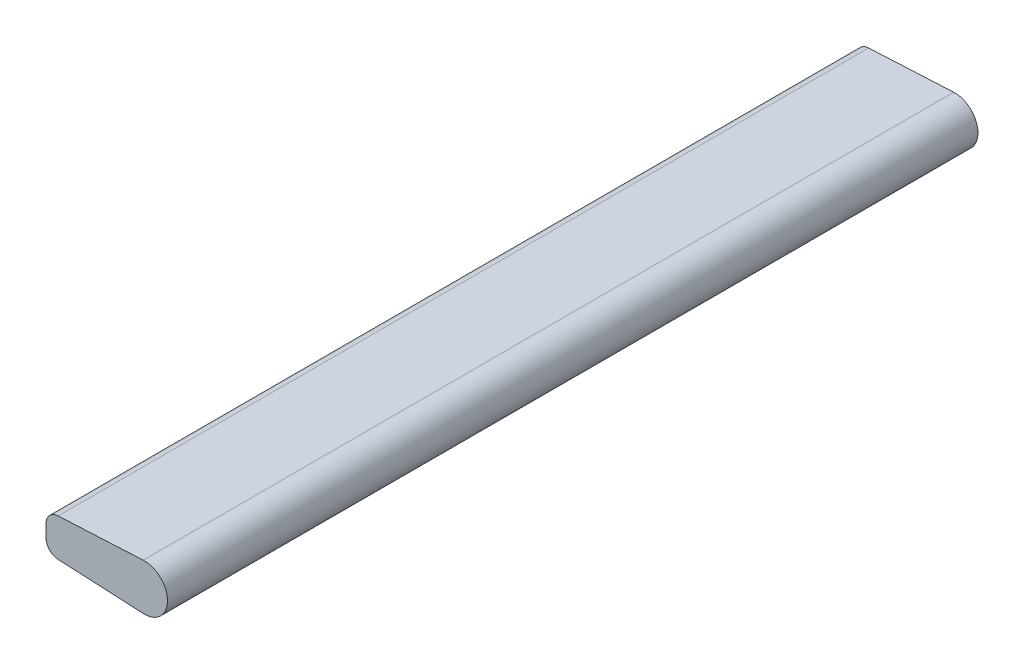
ISO-10303-21;
HEADER;
FILE_DESCRIPTION(('STEP AP214'),'2;1');
FILE_NAME('part.step','',(''),(''),'','','');
FILE_SCHEMA(('AUTOMOTIVE_DESIGN { 1 0 10303 214 1 1 1 1 }'));
ENDSEC;
DATA;
#1=APPLICATION_CONTEXT('core data for automotive mechanical design processes');
#2=APPLICATION_PROTOCOL_DEFINITION('international standard','automotive_design',2000,#1);
#3=PRODUCT_CONTEXT('',#1,'mechanical');
#4=PRODUCT('Part','Part','',(#3));
#5=PRODUCT_RELATED_PRODUCT_CATEGORY('part','',(#4));
#6=PRODUCT_DEFINITION_FORMATION('','',#4);
#7=PRODUCT_DEFINITION_CONTEXT('part definition',#1,'design');
#8=PRODUCT_DEFINITION('design','',#6,#7);
#9=PRODUCT_DEFINITION_SHAPE('','',#8);
#10=(LENGTH_UNIT() NAMED_UNIT(*) SI_UNIT(.MILLI.,.METRE.));
#11=(NAMED_UNIT(*) PLANE_ANGLE_UNIT() SI_UNIT($,.RADIAN.));
#12=(NAMED_UNIT(*) SI_UNIT($,.STERADIAN.) SOLID_ANGLE_UNIT());
#13=UNCERTAINTY_MEASURE_WITH_UNIT(LENGTH_MEASURE(1.E-05),#10,'distance_accuracy_value','');
#14=(GEOMETRIC_REPRESENTATION_CONTEXT(3) GLOBAL_UNCERTAINTY_ASSIGNED_CONTEXT((#13)) GLOBAL_UNIT_ASSIGNED_CONTEXT((#10,
#11,#12)) REPRESENTATION_CONTEXT('',''));
#15=CARTESIAN_POINT('',(0.,0.,0.));
#16=DIRECTION('',(0.,0.,1.));
#17=DIRECTION('',(1.,0.,0.));
#18=AXIS2_PLACEMENT_3D('',#15,#16,#17);
#19=CARTESIAN_POINT('',(-10.3425,1.5,100.));
#20=DIRECTION('',(0.,0.,-1.));
#21=DIRECTION('',(-1.,0.,0.));
#22=AXIS2_PLACEMENT_3D('',#19,#20,#21);
#23=CYLINDRICAL_SURFACE('',#22,3.15393504213387);
#24=CARTESIAN_POINT('',(-10.3425,1.5,-100.));
#25=DIRECTION('',(0.,0.,1.));
#26=DIRECTION('',(-1.,0.,0.));
#27=AXIS2_PLACEMENT_3D('',#24,#25,#26);
#28=CIRCLE('',#27,3.15393504213387);
#29=CARTESIAN_POINT('',(-10.5,4.65,-100.));
#30=VERTEX_POINT('',#29);
#31=CARTESIAN_POINT('',(-13.4964350421339,1.5,-100.));
#32=VERTEX_POINT('',#31);
#33=EDGE_CURVE('E118',#30,#32,#28,.T.);
#34=ORIENTED_EDGE('',*,*,#33,.T.);
#35=DIRECTION('',(0.,0.,-1.));
#36=VECTOR('',#35,1.);
#37=CARTESIAN_POINT('',(-13.4964350421339,1.5,100.));
#38=LINE('',#37,#36);
#39=CARTESIAN_POINT('',(-13.4964350421339,1.5,100.));
#40=VERTEX_POINT('',#39);
#41=EDGE_CURVE('E11',#40,#32,#38,.T.);
#42=ORIENTED_EDGE('',*,*,#41,.F.);
#43=CARTESIAN_POINT('',(-10.3425,1.5,100.));
#44=DIRECTION('',(0.,0.,1.));
#45=DIRECTION('',(-1.,0.,0.));
#46=AXIS2_PLACEMENT_3D('',#43,#44,#45);
#47=CIRCLE('',#46,3.15393504213387);
#48=CARTESIAN_POINT('',(-10.5,4.65,100.));
#49=VERTEX_POINT('',#48);
#50=EDGE_CURVE('E128',#49,#40,#47,.T.);
#51=ORIENTED_EDGE('',*,*,#50,.F.);
#52=DIRECTION('',(0.,0.,-1.));
#53=VECTOR('',#52,1.);
#54=CARTESIAN_POINT('',(-10.5,4.65,100.));
#55=LINE('',#54,#53);
#56=EDGE_CURVE('E114',#49,#30,#55,.T.);
#57=ORIENTED_EDGE('',*,*,#56,.T.);
#58=EDGE_LOOP('',(#34,#42,#51,#57));
#59=FACE_BOUND('',#58,.T.);
#60=ADVANCED_FACE('F34',(#59),#23,.T.);
#61=CARTESIAN_POINT('',(-13.4964350421339,-1.5,100.));
#62=DIRECTION('',(1.,0.,0.));
#63=DIRECTION('',(0.,1.,0.));
#64=AXIS2_PLACEMENT_3D('',#61,#62,#63);
#65=PLANE('',#64);
#66=DIRECTION('',(0.,-1.,0.));
#67=VECTOR('',#66,1.);
#68=CARTESIAN_POINT('',(-13.4964350421339,-1.5,-100.));
#69=LINE('',#68,#67);
#70=CARTESIAN_POINT('',(-13.4964350421339,-1.5,-100.));
#71=VERTEX_POINT('',#70);
#72=EDGE_CURVE('E121',#32,#71,#69,.T.);
#73=ORIENTED_EDGE('',*,*,#72,.T.);
#74=DIRECTION('',(0.,0.,-1.));
#75=VECTOR('',#74,1.);
#76=CARTESIAN_POINT('',(-13.4964350421339,-1.5,100.));
#77=LINE('',#76,#75);
#78=CARTESIAN_POINT('',(-13.4964350421339,-1.5,100.));
#79=VERTEX_POINT('',#78);
#80=EDGE_CURVE('E42',#79,#71,#77,.T.);
#81=ORIENTED_EDGE('',*,*,#80,.F.);
#82=DIRECTION('',(0.,-1.,0.));
#83=VECTOR('',#82,1.);
#84=CARTESIAN_POINT('',(-13.4964350421339,-1.5,100.));
#85=LINE('',#84,#83);
#86=EDGE_CURVE('E87',#40,#79,#85,.T.);
#87=ORIENTED_EDGE('',*,*,#86,.F.);
#88=ORIENTED_EDGE('',*,*,#41,.T.);
#89=EDGE_LOOP('',(#73,#81,#87,#88));
#90=FACE_BOUND('',#89,.T.);
#91=ADVANCED_FACE('F152',(#90),#65,.F.);
#92=CARTESIAN_POINT('',(-10.3425,-1.5,100.));
#93=DIRECTION('',(0.,0.,-1.));
#94=DIRECTION('',(-1.,0.,0.));
#95=AXIS2_PLACEMENT_3D('',#92,#93,#94);
#96=CYLINDRICAL_SURFACE('',#95,3.15393504213388);
#97=CARTESIAN_POINT('',(-10.3425,-1.5,-100.));
#98=DIRECTION('',(0.,0.,1.));
#99=DIRECTION('',(1.,0.,0.));
#100=AXIS2_PLACEMENT_3D('',#97,#98,#99);
#101=CIRCLE('',#100,3.15393504213388);
#102=CARTESIAN_POINT('',(-10.5,-4.65,-100.));
#103=VERTEX_POINT('',#102);
#104=EDGE_CURVE('E123',#71,#103,#101,.T.);
#105=ORIENTED_EDGE('',*,*,#104,.T.);
#106=DIRECTION('',(0.,0.,-1.));
#107=VECTOR('',#106,1.);
#108=CARTESIAN_POINT('',(-10.5,-4.65,100.));
#109=LINE('',#108,#107);
#110=CARTESIAN_POINT('',(-10.5,-4.65,100.));
#111=VERTEX_POINT('',#110);
#112=EDGE_CURVE('E109',#111,#103,#109,.T.);
#113=ORIENTED_EDGE('',*,*,#112,.F.);
#114=CARTESIAN_POINT('',(-10.3425,-1.5,100.));
#115=DIRECTION('',(0.,0.,1.));
#116=DIRECTION('',(1.,0.,0.));
#117=AXIS2_PLACEMENT_3D('',#114,#115,#116);
#118=CIRCLE('',#117,3.15393504213388);
#119=EDGE_CURVE('E100',#79,#111,#118,.T.);
#120=ORIENTED_EDGE('',*,*,#119,.F.);
#121=ORIENTED_EDGE('',*,*,#80,.T.);
#122=EDGE_LOOP('',(#105,#113,#120,#121));
#123=FACE_BOUND('',#122,.T.);
#124=ADVANCED_FACE('F134',(#123),#96,.T.);
#125=CARTESIAN_POINT('',(-10.5,-4.65,100.));
#126=DIRECTION('',(0.0499376169438921,0.998752338877845,0.));
#127=DIRECTION('',(-0.998752338877845,0.0499376169438921,0.));
#128=AXIS2_PLACEMENT_3D('',#125,#126,#127);
#129=PLANE('',#128);
#130=DIRECTION('',(0.998752338877845,-0.0499376169438921,0.));
#131=VECTOR('',#130,1.);
#132=CARTESIAN_POINT('',(-10.5,-4.65,-100.));
#133=LINE('',#132,#131);
#134=CARTESIAN_POINT('',(10.5,-5.7,-100.));
#135=VERTEX_POINT('',#134);
#136=EDGE_CURVE('E108',#103,#135,#133,.T.);
#137=ORIENTED_EDGE('',*,*,#136,.T.);
#138=DIRECTION('',(0.,0.,-1.));
#139=VECTOR('',#138,1.);
#140=CARTESIAN_POINT('',(10.5,-5.7,100.));
#141=LINE('',#140,#139);
#142=CARTESIAN_POINT('',(10.5,-5.7,100.));
#143=VERTEX_POINT('',#142);
#144=EDGE_CURVE('E105',#143,#135,#141,.T.);
#145=ORIENTED_EDGE('',*,*,#144,.F.);
#146=DIRECTION('',(0.998752338877845,-0.0499376169438921,0.));
#147=VECTOR('',#146,1.);
#148=CARTESIAN_POINT('',(-10.5,-4.65,100.));
#149=LINE('',#148,#147);
#150=EDGE_CURVE('E94',#111,#143,#149,.T.);
#151=ORIENTED_EDGE('',*,*,#150,.F.);
#152=ORIENTED_EDGE('',*,*,#112,.T.);
#153=EDGE_LOOP('',(#137,#145,#151,#152));
#154=FACE_BOUND('',#153,.T.);
#155=ADVANCED_FACE('F106',(#154),#129,.F.);
#156=CARTESIAN_POINT('',(10.785,0.,100.));
#157=DIRECTION('',(0.,0.,-1.));
#158=DIRECTION('',(-1.,0.,0.));
#159=AXIS2_PLACEMENT_3D('',#156,#157,#158);
#160=CYLINDRICAL_SURFACE('',#159,5.70712055243272);
#161=CARTESIAN_POINT('',(10.785,0.,-100.));
#162=DIRECTION('',(0.,0.,1.));
#163=DIRECTION('',(-1.,0.,0.));
#164=AXIS2_PLACEMENT_3D('',#161,#162,#163);
#165=CIRCLE('',#164,5.70712055243272);
#166=CARTESIAN_POINT('',(10.5,5.7,-100.));
#167=VERTEX_POINT('',#166);
#168=EDGE_CURVE('E73',#135,#167,#165,.T.);
#169=ORIENTED_EDGE('',*,*,#168,.T.);
#170=DIRECTION('',(0.,0.,-1.));
#171=VECTOR('',#170,1.);
#172=CARTESIAN_POINT('',(10.5,5.7,100.));
#173=LINE('',#172,#171);
#174=CARTESIAN_POINT('',(10.5,5.7,100.));
#175=VERTEX_POINT('',#174);
#176=EDGE_CURVE('E110',#175,#167,#173,.T.);
#177=ORIENTED_EDGE('',*,*,#176,.F.);
#178=CARTESIAN_POINT('',(10.785,0.,100.));
#179=DIRECTION('',(0.,0.,1.));
#180=DIRECTION('',(-1.,0.,0.));
#181=AXIS2_PLACEMENT_3D('',#178,#179,#180);
#182=CIRCLE('',#181,5.70712055243272);
#183=EDGE_CURVE('E98',#143,#175,#182,.T.);
#184=ORIENTED_EDGE('',*,*,#183,.F.);
#185=ORIENTED_EDGE('',*,*,#144,.T.);
#186=EDGE_LOOP('',(#169,#177,#184,#185));
#187=FACE_BOUND('',#186,.T.);
#188=ADVANCED_FACE('F112',(#187),#160,.T.);
#189=CARTESIAN_POINT('',(-10.5,4.65,100.));
#190=DIRECTION('',(0.0499376169438923,-0.998752338877845,0.));
#191=DIRECTION('',(0.998752338877845,0.0499376169438924,0.));
#192=AXIS2_PLACEMENT_3D('',#189,#190,#191);
#193=PLANE('',#192);
#194=DIRECTION('',(-0.998752338877845,-0.0499376169438923,0.));
#195=VECTOR('',#194,1.);
#196=CARTESIAN_POINT('',(-10.5,4.65,-100.));
#197=LINE('',#196,#195);
#198=EDGE_CURVE('E79',#167,#30,#197,.T.);
#199=ORIENTED_EDGE('',*,*,#198,.T.);
#200=ORIENTED_EDGE('',*,*,#56,.F.);
#201=DIRECTION('',(-0.998752338877845,-0.0499376169438923,0.));
#202=VECTOR('',#201,1.);
#203=CARTESIAN_POINT('',(-10.5,4.65,100.));
#204=LINE('',#203,#202);
#205=EDGE_CURVE('E50',#175,#49,#204,.T.);
#206=ORIENTED_EDGE('',*,*,#205,.F.);
#207=ORIENTED_EDGE('',*,*,#176,.T.);
#208=EDGE_LOOP('',(#199,#200,#206,#207));
#209=FACE_BOUND('',#208,.T.);
#210=ADVANCED_FACE('F141',(#209),#193,.F.);
#211=CARTESIAN_POINT('',(-10.3425,1.5,100.));
#212=DIRECTION('',(0.,0.,-1.));
#213=DIRECTION('',(-1.,0.,0.));
#214=AXIS2_PLACEMENT_3D('',#211,#212,#213);
#215=PLANE('',#214);
#216=ORIENTED_EDGE('',*,*,#50,.T.);
#217=ORIENTED_EDGE('',*,*,#86,.T.);
#218=ORIENTED_EDGE('',*,*,#119,.T.);
#219=ORIENTED_EDGE('',*,*,#150,.T.);
#220=ORIENTED_EDGE('',*,*,#183,.T.);
#221=ORIENTED_EDGE('',*,*,#205,.T.);
#222=EDGE_LOOP('',(#216,#217,#218,#219,#220,#221));
#223=FACE_BOUND('',#222,.T.);
#224=ADVANCED_FACE('F96',(#223),#215,.F.);
#225=CARTESIAN_POINT('',(-10.3425,1.5,-100.));
#226=DIRECTION('',(0.,0.,-1.));
#227=DIRECTION('',(-1.,0.,0.));
#228=AXIS2_PLACEMENT_3D('',#225,#226,#227);
#229=PLANE('',#228);
#230=ORIENTED_EDGE('',*,*,#33,.F.);
#231=ORIENTED_EDGE('',*,*,#198,.F.);
#232=ORIENTED_EDGE('',*,*,#168,.F.);
#233=ORIENTED_EDGE('',*,*,#136,.F.);
#234=ORIENTED_EDGE('',*,*,#104,.F.);
#235=ORIENTED_EDGE('',*,*,#72,.F.);
#236=EDGE_LOOP('',(#230,#231,#232,#233,#234,#235));
#237=FACE_BOUND('',#236,.T.);
#238=ADVANCED_FACE('F137',(#237),#229,.T.);
#239=CLOSED_SHELL('',(#60,#91,#124,#155,#188,#210,#224,#238));
#240=MANIFOLD_SOLID_BREP('B2',#239);
#241=ADVANCED_BREP_SHAPE_REPRESENTATION('',(#18,#240),#14);
#242=SHAPE_DEFINITION_REPRESENTATION(#9,#241);
ENDSEC;
END-ISO-10303-21;
